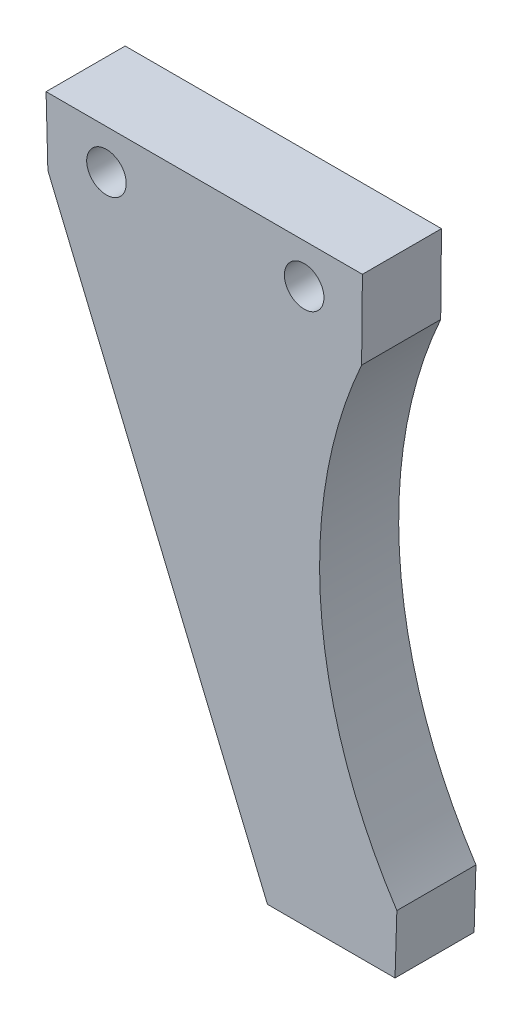
ISO-10303-21;
HEADER;
FILE_DESCRIPTION(('STEP AP214'),'2;1');
FILE_NAME('part.step','',(''),(''),'','','');
FILE_SCHEMA(('AUTOMOTIVE_DESIGN { 1 0 10303 214 1 1 1 1 }'));
ENDSEC;
DATA;
#1=APPLICATION_CONTEXT('core data for automotive mechanical design processes');
#2=APPLICATION_PROTOCOL_DEFINITION('international standard','automotive_design',2000,#1);
#3=PRODUCT_CONTEXT('',#1,'mechanical');
#4=PRODUCT('Part','Part','',(#3));
#5=PRODUCT_RELATED_PRODUCT_CATEGORY('part','',(#4));
#6=PRODUCT_DEFINITION_FORMATION('','',#4);
#7=PRODUCT_DEFINITION_CONTEXT('part definition',#1,'design');
#8=PRODUCT_DEFINITION('design','',#6,#7);
#9=PRODUCT_DEFINITION_SHAPE('','',#8);
#10=(LENGTH_UNIT() NAMED_UNIT(*) SI_UNIT(.MILLI.,.METRE.));
#11=(NAMED_UNIT(*) PLANE_ANGLE_UNIT() SI_UNIT($,.RADIAN.));
#12=(NAMED_UNIT(*) SI_UNIT($,.STERADIAN.) SOLID_ANGLE_UNIT());
#13=UNCERTAINTY_MEASURE_WITH_UNIT(LENGTH_MEASURE(1.E-05),#10,'distance_accuracy_value','');
#14=(GEOMETRIC_REPRESENTATION_CONTEXT(3) GLOBAL_UNCERTAINTY_ASSIGNED_CONTEXT((#13)) GLOBAL_UNIT_ASSIGNED_CONTEXT((#10,
#11,#12)) REPRESENTATION_CONTEXT('',''));
#15=CARTESIAN_POINT('',(0.,0.,0.));
#16=DIRECTION('',(0.,0.,1.));
#17=DIRECTION('',(1.,0.,0.));
#18=AXIS2_PLACEMENT_3D('',#15,#16,#17);
#19=CARTESIAN_POINT('',(129.080128546966,-41.6751157962345,20.));
#20=DIRECTION('',(0.,0.,1.));
#21=DIRECTION('',(1.,0.,0.));
#22=AXIS2_PLACEMENT_3D('',#19,#20,#21);
#23=PLANE('',#22);
#24=CARTESIAN_POINT('',(-44.8249035072163,17.6945793372604,20.));
#25=DIRECTION('',(0.,0.,1.));
#26=DIRECTION('',(1.,0.,0.));
#27=AXIS2_PLACEMENT_3D('',#24,#25,#26);
#28=CIRCLE('',#27,5.);
#29=CARTESIAN_POINT('',(-39.8249035072163,17.6945793372604,20.));
#30=VERTEX_POINT('',#29);
#31=EDGE_CURVE('E131',#30,#30,#28,.T.);
#32=ORIENTED_EDGE('',*,*,#31,.F.);
#33=EDGE_LOOP('',(#32));
#34=FACE_BOUND('',#33,.T.);
#35=DIRECTION('',(0.0265744450516084,-0.999646837073073,0.));
#36=VECTOR('',#35,1.);
#37=CARTESIAN_POINT('',(-60.0960411574024,27.6945793372604,20.));
#38=LINE('',#37,#36);
#39=CARTESIAN_POINT('',(-60.0960411574024,27.6945793372604,20.));
#40=VERTEX_POINT('',#39);
#41=CARTESIAN_POINT('',(-59.6435399408381,10.672910247588,20.));
#42=VERTEX_POINT('',#41);
#43=EDGE_CURVE('E140',#40,#42,#38,.T.);
#44=ORIENTED_EDGE('',*,*,#43,.T.);
#45=DIRECTION('',(0.38536293295557,-0.922765089231209,0.));
#46=VECTOR('',#45,1.);
#47=CARTESIAN_POINT('',(-59.6435399408381,10.672910247588,20.));
#48=LINE('',#47,#46);
#49=CARTESIAN_POINT('',(-4.10944982714057,-122.30542066274,20.));
#50=VERTEX_POINT('',#49);
#51=EDGE_CURVE('E93',#42,#50,#48,.T.);
#52=ORIENTED_EDGE('',*,*,#51,.T.);
#53=DIRECTION('',(1.,0.,0.));
#54=VECTOR('',#53,1.);
#55=CARTESIAN_POINT('',(-4.10944982714057,-122.30542066274,20.));
#56=LINE('',#55,#54);
#57=CARTESIAN_POINT('',(28.1569331645599,-122.30542066274,20.));
#58=VERTEX_POINT('',#57);
#59=EDGE_CURVE('E152',#50,#58,#56,.T.);
#60=ORIENTED_EDGE('',*,*,#59,.T.);
#61=DIRECTION('',(0.030715389314566,0.999528171118381,0.));
#62=VECTOR('',#61,1.);
#63=CARTESIAN_POINT('',(28.1569331645599,-122.30542066274,20.));
#64=LINE('',#63,#62);
#65=CARTESIAN_POINT('',(28.6178814930127,-107.30542066274,20.));
#66=VERTEX_POINT('',#65);
#67=EDGE_CURVE('E109',#58,#66,#64,.T.);
#68=ORIENTED_EDGE('',*,*,#67,.T.);
#69=CARTESIAN_POINT('',(129.080128546966,-41.6751157962345,20.));
#70=DIRECTION('',(0.,0.,-1.));
#71=DIRECTION('',(1.,0.,0.));
#72=AXIS2_PLACEMENT_3D('',#69,#70,#71);
#73=CIRCLE('',#72,120.);
#74=CARTESIAN_POINT('',(19.7063053422077,7.69457933726038,20.));
#75=VERTEX_POINT('',#74);
#76=EDGE_CURVE('E103',#66,#75,#73,.T.);
#77=ORIENTED_EDGE('',*,*,#76,.T.);
#78=DIRECTION('',(0.00988219244791985,0.999951169944024,0.));
#79=VECTOR('',#78,1.);
#80=CARTESIAN_POINT('',(19.9039588425976,27.6945793372604,20.));
#81=LINE('',#80,#79);
#82=CARTESIAN_POINT('',(19.9039588425976,27.6945793372604,20.));
#83=VERTEX_POINT('',#82);
#84=EDGE_CURVE('E107',#75,#83,#81,.T.);
#85=ORIENTED_EDGE('',*,*,#84,.T.);
#86=DIRECTION('',(-1.,0.,0.));
#87=VECTOR('',#86,1.);
#88=CARTESIAN_POINT('',(-60.0960411574024,27.6945793372604,20.));
#89=LINE('',#88,#87);
#90=EDGE_CURVE('E53',#83,#40,#89,.T.);
#91=ORIENTED_EDGE('',*,*,#90,.T.);
#92=EDGE_LOOP('',(#44,#52,#60,#68,#77,#85,#91));
#93=FACE_BOUND('',#92,.T.);
#94=CARTESIAN_POINT('',(5.17509649278375,17.6945793372604,20.));
#95=DIRECTION('',(0.,0.,1.));
#96=DIRECTION('',(1.,0.,0.));
#97=AXIS2_PLACEMENT_3D('',#94,#95,#96);
#98=CIRCLE('',#97,5.);
#99=CARTESIAN_POINT('',(10.1750964927837,17.6945793372604,20.));
#100=VERTEX_POINT('',#99);
#101=EDGE_CURVE('E167',#100,#100,#98,.T.);
#102=ORIENTED_EDGE('',*,*,#101,.F.);
#103=EDGE_LOOP('',(#102));
#104=FACE_BOUND('',#103,.T.);
#105=ADVANCED_FACE('F36',(#34,#93,#104),#23,.T.);
#106=CARTESIAN_POINT('',(129.080128546966,-41.6751157962345,0.));
#107=DIRECTION('',(0.,0.,1.));
#108=DIRECTION('',(1.,0.,0.));
#109=AXIS2_PLACEMENT_3D('',#106,#107,#108);
#110=PLANE('',#109);
#111=DIRECTION('',(0.0265744450516084,-0.999646837073073,0.));
#112=VECTOR('',#111,1.);
#113=CARTESIAN_POINT('',(-60.0960411574024,27.6945793372604,0.));
#114=LINE('',#113,#112);
#115=CARTESIAN_POINT('',(-60.0960411574024,27.6945793372604,0.));
#116=VERTEX_POINT('',#115);
#117=CARTESIAN_POINT('',(-59.6435399408381,10.672910247588,0.));
#118=VERTEX_POINT('',#117);
#119=EDGE_CURVE('E127',#116,#118,#114,.T.);
#120=ORIENTED_EDGE('',*,*,#119,.F.);
#121=DIRECTION('',(-1.,0.,0.));
#122=VECTOR('',#121,1.);
#123=CARTESIAN_POINT('',(-60.0960411574024,27.6945793372604,0.));
#124=LINE('',#123,#122);
#125=CARTESIAN_POINT('',(19.9039588425976,27.6945793372604,0.));
#126=VERTEX_POINT('',#125);
#127=EDGE_CURVE('E85',#126,#116,#124,.T.);
#128=ORIENTED_EDGE('',*,*,#127,.F.);
#129=DIRECTION('',(0.00988219244791985,0.999951169944024,0.));
#130=VECTOR('',#129,1.);
#131=CARTESIAN_POINT('',(19.9039588425976,27.6945793372604,0.));
#132=LINE('',#131,#130);
#133=CARTESIAN_POINT('',(19.7063053422077,7.69457933726038,0.));
#134=VERTEX_POINT('',#133);
#135=EDGE_CURVE('E79',#134,#126,#132,.T.);
#136=ORIENTED_EDGE('',*,*,#135,.F.);
#137=CARTESIAN_POINT('',(129.080128546966,-41.6751157962345,0.));
#138=DIRECTION('',(0.,0.,-1.));
#139=DIRECTION('',(1.,0.,0.));
#140=AXIS2_PLACEMENT_3D('',#137,#138,#139);
#141=CIRCLE('',#140,120.);
#142=CARTESIAN_POINT('',(28.6178814930127,-107.30542066274,0.));
#143=VERTEX_POINT('',#142);
#144=EDGE_CURVE('E117',#143,#134,#141,.T.);
#145=ORIENTED_EDGE('',*,*,#144,.F.);
#146=DIRECTION('',(0.030715389314566,0.999528171118381,0.));
#147=VECTOR('',#146,1.);
#148=CARTESIAN_POINT('',(28.1569331645599,-122.30542066274,0.));
#149=LINE('',#148,#147);
#150=CARTESIAN_POINT('',(28.1569331645599,-122.30542066274,0.));
#151=VERTEX_POINT('',#150);
#152=EDGE_CURVE('E135',#151,#143,#149,.T.);
#153=ORIENTED_EDGE('',*,*,#152,.F.);
#154=DIRECTION('',(1.,0.,0.));
#155=VECTOR('',#154,1.);
#156=CARTESIAN_POINT('',(-4.10944982714057,-122.30542066274,0.));
#157=LINE('',#156,#155);
#158=CARTESIAN_POINT('',(-4.10944982714057,-122.30542066274,0.));
#159=VERTEX_POINT('',#158);
#160=EDGE_CURVE('E133',#159,#151,#157,.T.);
#161=ORIENTED_EDGE('',*,*,#160,.F.);
#162=DIRECTION('',(0.38536293295557,-0.922765089231209,0.));
#163=VECTOR('',#162,1.);
#164=CARTESIAN_POINT('',(-59.6435399408381,10.672910247588,0.));
#165=LINE('',#164,#163);
#166=EDGE_CURVE('E130',#118,#159,#165,.T.);
#167=ORIENTED_EDGE('',*,*,#166,.F.);
#168=EDGE_LOOP('',(#120,#128,#136,#145,#153,#161,#167));
#169=FACE_BOUND('',#168,.T.);
#170=CARTESIAN_POINT('',(-44.8249035072163,17.6945793372604,0.));
#171=DIRECTION('',(0.,0.,1.));
#172=DIRECTION('',(1.,0.,0.));
#173=AXIS2_PLACEMENT_3D('',#170,#171,#172);
#174=CIRCLE('',#173,5.);
#175=CARTESIAN_POINT('',(-39.8249035072163,17.6945793372604,0.));
#176=VERTEX_POINT('',#175);
#177=EDGE_CURVE('E164',#176,#176,#174,.T.);
#178=ORIENTED_EDGE('',*,*,#177,.T.);
#179=EDGE_LOOP('',(#178));
#180=FACE_BOUND('',#179,.T.);
#181=CARTESIAN_POINT('',(5.17509649278375,17.6945793372604,0.));
#182=DIRECTION('',(0.,0.,1.));
#183=DIRECTION('',(1.,0.,0.));
#184=AXIS2_PLACEMENT_3D('',#181,#182,#183);
#185=CIRCLE('',#184,5.);
#186=CARTESIAN_POINT('',(10.1750964927837,17.6945793372604,0.));
#187=VERTEX_POINT('',#186);
#188=EDGE_CURVE('E170',#187,#187,#185,.T.);
#189=ORIENTED_EDGE('',*,*,#188,.T.);
#190=EDGE_LOOP('',(#189));
#191=FACE_BOUND('',#190,.T.);
#192=ADVANCED_FACE('F156',(#169,#180,#191),#110,.F.);
#193=CARTESIAN_POINT('',(-60.0960411574024,27.6945793372604,20.));
#194=DIRECTION('',(0.999646837073073,0.0265744450516084,0.));
#195=DIRECTION('',(-0.0265744450516084,0.999646837073073,0.));
#196=AXIS2_PLACEMENT_3D('',#193,#194,#195);
#197=PLANE('',#196);
#198=ORIENTED_EDGE('',*,*,#119,.T.);
#199=DIRECTION('',(0.,0.,-1.));
#200=VECTOR('',#199,1.);
#201=CARTESIAN_POINT('',(-59.6435399408381,10.672910247588,20.));
#202=LINE('',#201,#200);
#203=EDGE_CURVE('E11',#42,#118,#202,.T.);
#204=ORIENTED_EDGE('',*,*,#203,.F.);
#205=ORIENTED_EDGE('',*,*,#43,.F.);
#206=DIRECTION('',(0.,0.,-1.));
#207=VECTOR('',#206,1.);
#208=CARTESIAN_POINT('',(-60.0960411574024,27.6945793372604,20.));
#209=LINE('',#208,#207);
#210=EDGE_CURVE('E123',#40,#116,#209,.T.);
#211=ORIENTED_EDGE('',*,*,#210,.T.);
#212=EDGE_LOOP('',(#198,#204,#205,#211));
#213=FACE_BOUND('',#212,.T.);
#214=ADVANCED_FACE('F38',(#213),#197,.F.);
#215=CARTESIAN_POINT('',(-59.6435399408381,10.672910247588,20.));
#216=DIRECTION('',(0.922765089231209,0.38536293295557,0.));
#217=DIRECTION('',(-0.38536293295557,0.922765089231209,0.));
#218=AXIS2_PLACEMENT_3D('',#215,#216,#217);
#219=PLANE('',#218);
#220=ORIENTED_EDGE('',*,*,#166,.T.);
#221=DIRECTION('',(0.,0.,-1.));
#222=VECTOR('',#221,1.);
#223=CARTESIAN_POINT('',(-4.10944982714057,-122.30542066274,20.));
#224=LINE('',#223,#222);
#225=EDGE_CURVE('E45',#50,#159,#224,.T.);
#226=ORIENTED_EDGE('',*,*,#225,.F.);
#227=ORIENTED_EDGE('',*,*,#51,.F.);
#228=ORIENTED_EDGE('',*,*,#203,.T.);
#229=EDGE_LOOP('',(#220,#226,#227,#228));
#230=FACE_BOUND('',#229,.T.);
#231=ADVANCED_FACE('F200',(#230),#219,.F.);
#232=CARTESIAN_POINT('',(-4.10944982714057,-122.30542066274,20.));
#233=DIRECTION('',(0.,1.,0.));
#234=DIRECTION('',(0.,0.,1.));
#235=AXIS2_PLACEMENT_3D('',#232,#233,#234);
#236=PLANE('',#235);
#237=ORIENTED_EDGE('',*,*,#160,.T.);
#238=DIRECTION('',(0.,0.,-1.));
#239=VECTOR('',#238,1.);
#240=CARTESIAN_POINT('',(28.1569331645599,-122.30542066274,20.));
#241=LINE('',#240,#239);
#242=EDGE_CURVE('E144',#58,#151,#241,.T.);
#243=ORIENTED_EDGE('',*,*,#242,.F.);
#244=ORIENTED_EDGE('',*,*,#59,.F.);
#245=ORIENTED_EDGE('',*,*,#225,.T.);
#246=EDGE_LOOP('',(#237,#243,#244,#245));
#247=FACE_BOUND('',#246,.T.);
#248=ADVANCED_FACE('F150',(#247),#236,.F.);
#249=CARTESIAN_POINT('',(28.1569331645599,-122.30542066274,20.));
#250=DIRECTION('',(-0.999528171118381,0.030715389314566,0.));
#251=DIRECTION('',(-0.030715389314566,-0.999528171118381,0.));
#252=AXIS2_PLACEMENT_3D('',#249,#250,#251);
#253=PLANE('',#252);
#254=ORIENTED_EDGE('',*,*,#152,.T.);
#255=DIRECTION('',(0.,0.,-1.));
#256=VECTOR('',#255,1.);
#257=CARTESIAN_POINT('',(28.6178814930127,-107.30542066274,20.));
#258=LINE('',#257,#256);
#259=EDGE_CURVE('E118',#66,#143,#258,.T.);
#260=ORIENTED_EDGE('',*,*,#259,.F.);
#261=ORIENTED_EDGE('',*,*,#67,.F.);
#262=ORIENTED_EDGE('',*,*,#242,.T.);
#263=EDGE_LOOP('',(#254,#260,#261,#262));
#264=FACE_BOUND('',#263,.T.);
#265=ADVANCED_FACE('F159',(#264),#253,.F.);
#266=CARTESIAN_POINT('',(129.080128546966,-41.6751157962345,20.));
#267=DIRECTION('',(0.,0.,-1.));
#268=DIRECTION('',(-1.,0.,0.));
#269=AXIS2_PLACEMENT_3D('',#266,#267,#268);
#270=CYLINDRICAL_SURFACE('',#269,120.);
#271=ORIENTED_EDGE('',*,*,#144,.T.);
#272=DIRECTION('',(0.,0.,-1.));
#273=VECTOR('',#272,1.);
#274=CARTESIAN_POINT('',(19.7063053422077,7.69457933726038,20.));
#275=LINE('',#274,#273);
#276=EDGE_CURVE('E114',#75,#134,#275,.T.);
#277=ORIENTED_EDGE('',*,*,#276,.F.);
#278=ORIENTED_EDGE('',*,*,#76,.F.);
#279=ORIENTED_EDGE('',*,*,#259,.T.);
#280=EDGE_LOOP('',(#271,#277,#278,#279));
#281=FACE_BOUND('',#280,.T.);
#282=ADVANCED_FACE('F115',(#281),#270,.F.);
#283=CARTESIAN_POINT('',(19.9039588425976,27.6945793372604,20.));
#284=DIRECTION('',(-0.999951169944024,0.00988219244791985,0.));
#285=DIRECTION('',(-0.00988219244791985,-0.999951169944024,0.));
#286=AXIS2_PLACEMENT_3D('',#283,#284,#285);
#287=PLANE('',#286);
#288=ORIENTED_EDGE('',*,*,#135,.T.);
#289=DIRECTION('',(0.,0.,-1.));
#290=VECTOR('',#289,1.);
#291=CARTESIAN_POINT('',(19.9039588425976,27.6945793372604,20.));
#292=LINE('',#291,#290);
#293=EDGE_CURVE('E119',#83,#126,#292,.T.);
#294=ORIENTED_EDGE('',*,*,#293,.F.);
#295=ORIENTED_EDGE('',*,*,#84,.F.);
#296=ORIENTED_EDGE('',*,*,#276,.T.);
#297=EDGE_LOOP('',(#288,#294,#295,#296));
#298=FACE_BOUND('',#297,.T.);
#299=ADVANCED_FACE('F121',(#298),#287,.F.);
#300=CARTESIAN_POINT('',(-60.0960411574024,27.6945793372604,20.));
#301=DIRECTION('',(0.,-1.,0.));
#302=DIRECTION('',(0.,0.,-1.));
#303=AXIS2_PLACEMENT_3D('',#300,#301,#302);
#304=PLANE('',#303);
#305=ORIENTED_EDGE('',*,*,#127,.T.);
#306=ORIENTED_EDGE('',*,*,#210,.F.);
#307=ORIENTED_EDGE('',*,*,#90,.F.);
#308=ORIENTED_EDGE('',*,*,#293,.T.);
#309=EDGE_LOOP('',(#305,#306,#307,#308));
#310=FACE_BOUND('',#309,.T.);
#311=ADVANCED_FACE('F190',(#310),#304,.F.);
#312=CARTESIAN_POINT('',(-44.8249035072163,17.6945793372604,20.));
#313=DIRECTION('',(0.,0.,-1.));
#314=DIRECTION('',(-1.,0.,0.));
#315=AXIS2_PLACEMENT_3D('',#312,#313,#314);
#316=CYLINDRICAL_SURFACE('',#315,5.);
#317=ORIENTED_EDGE('',*,*,#31,.T.);
#318=EDGE_LOOP('',(#317));
#319=FACE_BOUND('',#318,.T.);
#320=ORIENTED_EDGE('',*,*,#177,.F.);
#321=EDGE_LOOP('',(#320));
#322=FACE_BOUND('',#321,.T.);
#323=ADVANCED_FACE('F187',(#319,#322),#316,.F.);
#324=CARTESIAN_POINT('',(5.17509649278375,17.6945793372604,20.));
#325=DIRECTION('',(0.,0.,-1.));
#326=DIRECTION('',(-1.,0.,0.));
#327=AXIS2_PLACEMENT_3D('',#324,#325,#326);
#328=CYLINDRICAL_SURFACE('',#327,5.);
#329=ORIENTED_EDGE('',*,*,#101,.T.);
#330=EDGE_LOOP('',(#329));
#331=FACE_BOUND('',#330,.T.);
#332=ORIENTED_EDGE('',*,*,#188,.F.);
#333=EDGE_LOOP('',(#332));
#334=FACE_BOUND('',#333,.T.);
#335=ADVANCED_FACE('F176',(#331,#334),#328,.F.);
#336=CLOSED_SHELL('',(#105,#192,#214,#231,#248,#265,#282,#299,#311,#323,#335));
#337=MANIFOLD_SOLID_BREP('B2',#336);
#338=ADVANCED_BREP_SHAPE_REPRESENTATION('',(#18,#337),#14);
#339=SHAPE_DEFINITION_REPRESENTATION(#9,#338);
ENDSEC;
END-ISO-10303-21;
